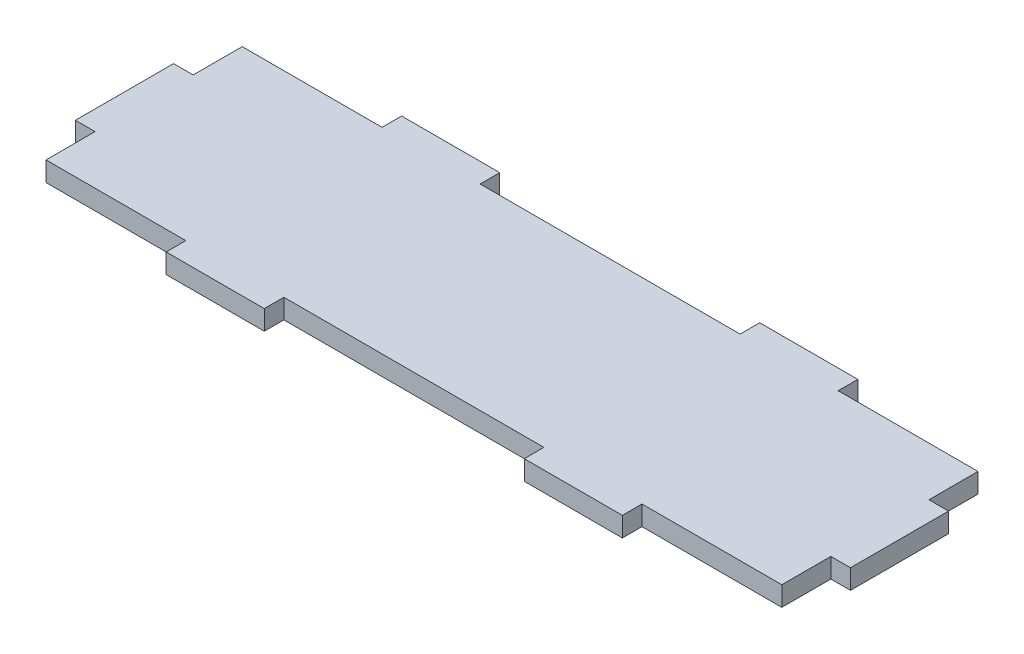
ISO-10303-21;
HEADER;
FILE_DESCRIPTION(('STEP AP214'),'2;1');
FILE_NAME('part.step','',(''),(''),'','','');
FILE_SCHEMA(('AUTOMOTIVE_DESIGN { 1 0 10303 214 1 1 1 1 }'));
ENDSEC;
DATA;
#1=APPLICATION_CONTEXT('core data for automotive mechanical design processes');
#2=APPLICATION_PROTOCOL_DEFINITION('international standard','automotive_design',2000,#1);
#3=PRODUCT_CONTEXT('',#1,'mechanical');
#4=PRODUCT('Part','Part','',(#3));
#5=PRODUCT_RELATED_PRODUCT_CATEGORY('part','',(#4));
#6=PRODUCT_DEFINITION_FORMATION('','',#4);
#7=PRODUCT_DEFINITION_CONTEXT('part definition',#1,'design');
#8=PRODUCT_DEFINITION('design','',#6,#7);
#9=PRODUCT_DEFINITION_SHAPE('','',#8);
#10=(LENGTH_UNIT() NAMED_UNIT(*) SI_UNIT(.MILLI.,.METRE.));
#11=(NAMED_UNIT(*) PLANE_ANGLE_UNIT() SI_UNIT($,.RADIAN.));
#12=(NAMED_UNIT(*) SI_UNIT($,.STERADIAN.) SOLID_ANGLE_UNIT());
#13=UNCERTAINTY_MEASURE_WITH_UNIT(LENGTH_MEASURE(1.E-05),#10,'distance_accuracy_value','');
#14=(GEOMETRIC_REPRESENTATION_CONTEXT(3) GLOBAL_UNCERTAINTY_ASSIGNED_CONTEXT((#13)) GLOBAL_UNIT_ASSIGNED_CONTEXT((#10,
#11,#12)) REPRESENTATION_CONTEXT('',''));
#15=CARTESIAN_POINT('',(0.,0.,0.));
#16=DIRECTION('',(0.,0.,1.));
#17=DIRECTION('',(1.,0.,0.));
#18=AXIS2_PLACEMENT_3D('',#15,#16,#17);
#19=CARTESIAN_POINT('',(0.,4.,0.));
#20=DIRECTION('',(1.,0.,0.));
#21=DIRECTION('',(0.,0.,-1.));
#22=AXIS2_PLACEMENT_3D('',#19,#20,#21);
#23=PLANE('',#22);
#24=DIRECTION('',(0.,0.,1.));
#25=VECTOR('',#24,1.);
#26=CARTESIAN_POINT('',(0.,0.,0.));
#27=LINE('',#26,#25);
#28=CARTESIAN_POINT('',(0.,0.,-9.99999999999999));
#29=VERTEX_POINT('',#28);
#30=CARTESIAN_POINT('',(0.,0.,0.));
#31=VERTEX_POINT('',#30);
#32=EDGE_CURVE('E250',#29,#31,#27,.T.);
#33=ORIENTED_EDGE('',*,*,#32,.T.);
#34=DIRECTION('',(0.,-1.,0.));
#35=VECTOR('',#34,1.);
#36=CARTESIAN_POINT('',(0.,4.,0.));
#37=LINE('',#36,#35);
#38=CARTESIAN_POINT('',(0.,4.,0.));
#39=VERTEX_POINT('',#38);
#40=EDGE_CURVE('E11',#39,#31,#37,.T.);
#41=ORIENTED_EDGE('',*,*,#40,.F.);
#42=DIRECTION('',(0.,0.,1.));
#43=VECTOR('',#42,1.);
#44=CARTESIAN_POINT('',(0.,4.,0.));
#45=LINE('',#44,#43);
#46=CARTESIAN_POINT('',(0.,4.,-9.99999999999999));
#47=VERTEX_POINT('',#46);
#48=EDGE_CURVE('E304',#47,#39,#45,.T.);
#49=ORIENTED_EDGE('',*,*,#48,.F.);
#50=DIRECTION('',(0.,-1.,0.));
#51=VECTOR('',#50,1.);
#52=CARTESIAN_POINT('',(0.,4.,-9.99999999999999));
#53=LINE('',#52,#51);
#54=EDGE_CURVE('E246',#47,#29,#53,.T.);
#55=ORIENTED_EDGE('',*,*,#54,.T.);
#56=EDGE_LOOP('',(#33,#41,#49,#55));
#57=FACE_BOUND('',#56,.T.);
#58=ADVANCED_FACE('F34',(#57),#23,.F.);
#59=CARTESIAN_POINT('',(0.,4.,0.));
#60=DIRECTION('',(0.,0.,-1.));
#61=DIRECTION('',(-1.,0.,0.));
#62=AXIS2_PLACEMENT_3D('',#59,#60,#61);
#63=PLANE('',#62);
#64=DIRECTION('',(1.,0.,0.));
#65=VECTOR('',#64,1.);
#66=CARTESIAN_POINT('',(0.,0.,0.));
#67=LINE('',#66,#65);
#68=CARTESIAN_POINT('',(28.5,0.,0.));
#69=VERTEX_POINT('',#68);
#70=EDGE_CURVE('E253',#31,#69,#67,.T.);
#71=ORIENTED_EDGE('',*,*,#70,.T.);
#72=DIRECTION('',(0.,-1.,0.));
#73=VECTOR('',#72,1.);
#74=CARTESIAN_POINT('',(28.5,4.,0.));
#75=LINE('',#74,#73);
#76=CARTESIAN_POINT('',(28.5,4.,0.));
#77=VERTEX_POINT('',#76);
#78=EDGE_CURVE('E42',#77,#69,#75,.T.);
#79=ORIENTED_EDGE('',*,*,#78,.F.);
#80=DIRECTION('',(1.,0.,0.));
#81=VECTOR('',#80,1.);
#82=CARTESIAN_POINT('',(0.,4.,0.));
#83=LINE('',#82,#81);
#84=EDGE_CURVE('E153',#39,#77,#83,.T.);
#85=ORIENTED_EDGE('',*,*,#84,.F.);
#86=ORIENTED_EDGE('',*,*,#40,.T.);
#87=EDGE_LOOP('',(#71,#79,#85,#86));
#88=FACE_BOUND('',#87,.T.);
#89=ADVANCED_FACE('F462',(#88),#63,.F.);
#90=CARTESIAN_POINT('',(28.5,4.,0.));
#91=DIRECTION('',(1.,0.,0.));
#92=DIRECTION('',(0.,0.,-1.));
#93=AXIS2_PLACEMENT_3D('',#90,#91,#92);
#94=PLANE('',#93);
#95=DIRECTION('',(0.,0.,1.));
#96=VECTOR('',#95,1.);
#97=CARTESIAN_POINT('',(28.5,0.,0.));
#98=LINE('',#97,#96);
#99=CARTESIAN_POINT('',(28.5,0.,4.));
#100=VERTEX_POINT('',#99);
#101=EDGE_CURVE('E255',#69,#100,#98,.T.);
#102=ORIENTED_EDGE('',*,*,#101,.T.);
#103=DIRECTION('',(0.,-1.,0.));
#104=VECTOR('',#103,1.);
#105=CARTESIAN_POINT('',(28.5,4.,4.));
#106=LINE('',#105,#104);
#107=CARTESIAN_POINT('',(28.5,4.,4.));
#108=VERTEX_POINT('',#107);
#109=EDGE_CURVE('E371',#108,#100,#106,.T.);
#110=ORIENTED_EDGE('',*,*,#109,.F.);
#111=DIRECTION('',(0.,0.,1.));
#112=VECTOR('',#111,1.);
#113=CARTESIAN_POINT('',(28.5,4.,0.));
#114=LINE('',#113,#112);
#115=EDGE_CURVE('E379',#77,#108,#114,.T.);
#116=ORIENTED_EDGE('',*,*,#115,.F.);
#117=ORIENTED_EDGE('',*,*,#78,.T.);
#118=EDGE_LOOP('',(#102,#110,#116,#117));
#119=FACE_BOUND('',#118,.T.);
#120=ADVANCED_FACE('F377',(#119),#94,.F.);
#121=CARTESIAN_POINT('',(28.5,4.,4.));
#122=DIRECTION('',(0.,0.,-1.));
#123=DIRECTION('',(-1.,0.,0.));
#124=AXIS2_PLACEMENT_3D('',#121,#122,#123);
#125=PLANE('',#124);
#126=DIRECTION('',(1.,0.,0.));
#127=VECTOR('',#126,1.);
#128=CARTESIAN_POINT('',(28.5,0.,4.));
#129=LINE('',#128,#127);
#130=CARTESIAN_POINT('',(48.5,0.,4.));
#131=VERTEX_POINT('',#130);
#132=EDGE_CURVE('E257',#100,#131,#129,.T.);
#133=ORIENTED_EDGE('',*,*,#132,.T.);
#134=DIRECTION('',(0.,-1.,0.));
#135=VECTOR('',#134,1.);
#136=CARTESIAN_POINT('',(48.5,4.,4.));
#137=LINE('',#136,#135);
#138=CARTESIAN_POINT('',(48.5,4.,4.));
#139=VERTEX_POINT('',#138);
#140=EDGE_CURVE('E368',#139,#131,#137,.T.);
#141=ORIENTED_EDGE('',*,*,#140,.F.);
#142=DIRECTION('',(1.,0.,0.));
#143=VECTOR('',#142,1.);
#144=CARTESIAN_POINT('',(28.5,4.,4.));
#145=LINE('',#144,#143);
#146=EDGE_CURVE('E397',#108,#139,#145,.T.);
#147=ORIENTED_EDGE('',*,*,#146,.F.);
#148=ORIENTED_EDGE('',*,*,#109,.T.);
#149=EDGE_LOOP('',(#133,#141,#147,#148));
#150=FACE_BOUND('',#149,.T.);
#151=ADVANCED_FACE('F388',(#150),#125,.F.);
#152=CARTESIAN_POINT('',(48.5,4.,0.));
#153=DIRECTION('',(-1.,0.,0.));
#154=DIRECTION('',(0.,0.,1.));
#155=AXIS2_PLACEMENT_3D('',#152,#153,#154);
#156=PLANE('',#155);
#157=DIRECTION('',(0.,0.,-1.));
#158=VECTOR('',#157,1.);
#159=CARTESIAN_POINT('',(48.5,0.,0.));
#160=LINE('',#159,#158);
#161=CARTESIAN_POINT('',(48.5,0.,0.));
#162=VERTEX_POINT('',#161);
#163=EDGE_CURVE('E259',#131,#162,#160,.T.);
#164=ORIENTED_EDGE('',*,*,#163,.T.);
#165=DIRECTION('',(0.,-1.,0.));
#166=VECTOR('',#165,1.);
#167=CARTESIAN_POINT('',(48.5,4.,0.));
#168=LINE('',#167,#166);
#169=CARTESIAN_POINT('',(48.5,4.,0.));
#170=VERTEX_POINT('',#169);
#171=EDGE_CURVE('E365',#170,#162,#168,.T.);
#172=ORIENTED_EDGE('',*,*,#171,.F.);
#173=DIRECTION('',(0.,0.,-1.));
#174=VECTOR('',#173,1.);
#175=CARTESIAN_POINT('',(48.5,4.,0.));
#176=LINE('',#175,#174);
#177=EDGE_CURVE('E394',#139,#170,#176,.T.);
#178=ORIENTED_EDGE('',*,*,#177,.F.);
#179=ORIENTED_EDGE('',*,*,#140,.T.);
#180=EDGE_LOOP('',(#164,#172,#178,#179));
#181=FACE_BOUND('',#180,.T.);
#182=ADVANCED_FACE('F392',(#181),#156,.F.);
#183=CARTESIAN_POINT('',(48.5,4.,0.));
#184=DIRECTION('',(0.,0.,-1.));
#185=DIRECTION('',(-1.,0.,0.));
#186=AXIS2_PLACEMENT_3D('',#183,#184,#185);
#187=PLANE('',#186);
#188=DIRECTION('',(1.,0.,0.));
#189=VECTOR('',#188,1.);
#190=CARTESIAN_POINT('',(48.5,0.,0.));
#191=LINE('',#190,#189);
#192=CARTESIAN_POINT('',(101.5,0.,0.));
#193=VERTEX_POINT('',#192);
#194=EDGE_CURVE('E261',#162,#193,#191,.T.);
#195=ORIENTED_EDGE('',*,*,#194,.T.);
#196=DIRECTION('',(0.,-1.,0.));
#197=VECTOR('',#196,1.);
#198=CARTESIAN_POINT('',(101.5,4.,0.));
#199=LINE('',#198,#197);
#200=CARTESIAN_POINT('',(101.5,4.,0.));
#201=VERTEX_POINT('',#200);
#202=EDGE_CURVE('E362',#201,#193,#199,.T.);
#203=ORIENTED_EDGE('',*,*,#202,.F.);
#204=DIRECTION('',(1.,0.,0.));
#205=VECTOR('',#204,1.);
#206=CARTESIAN_POINT('',(48.5,4.,0.));
#207=LINE('',#206,#205);
#208=EDGE_CURVE('E396',#170,#201,#207,.T.);
#209=ORIENTED_EDGE('',*,*,#208,.F.);
#210=ORIENTED_EDGE('',*,*,#171,.T.);
#211=EDGE_LOOP('',(#195,#203,#209,#210));
#212=FACE_BOUND('',#211,.T.);
#213=ADVANCED_FACE('F475',(#212),#187,.F.);
#214=CARTESIAN_POINT('',(101.5,4.,0.));
#215=DIRECTION('',(1.,0.,0.));
#216=DIRECTION('',(0.,0.,-1.));
#217=AXIS2_PLACEMENT_3D('',#214,#215,#216);
#218=PLANE('',#217);
#219=DIRECTION('',(0.,0.,1.));
#220=VECTOR('',#219,1.);
#221=CARTESIAN_POINT('',(101.5,0.,0.));
#222=LINE('',#221,#220);
#223=CARTESIAN_POINT('',(101.5,0.,4.));
#224=VERTEX_POINT('',#223);
#225=EDGE_CURVE('E263',#193,#224,#222,.T.);
#226=ORIENTED_EDGE('',*,*,#225,.T.);
#227=DIRECTION('',(0.,-1.,0.));
#228=VECTOR('',#227,1.);
#229=CARTESIAN_POINT('',(101.5,4.,4.));
#230=LINE('',#229,#228);
#231=CARTESIAN_POINT('',(101.5,4.,4.));
#232=VERTEX_POINT('',#231);
#233=EDGE_CURVE('E359',#232,#224,#230,.T.);
#234=ORIENTED_EDGE('',*,*,#233,.F.);
#235=DIRECTION('',(0.,0.,1.));
#236=VECTOR('',#235,1.);
#237=CARTESIAN_POINT('',(101.5,4.,0.));
#238=LINE('',#237,#236);
#239=EDGE_CURVE('E399',#201,#232,#238,.T.);
#240=ORIENTED_EDGE('',*,*,#239,.F.);
#241=ORIENTED_EDGE('',*,*,#202,.T.);
#242=EDGE_LOOP('',(#226,#234,#240,#241));
#243=FACE_BOUND('',#242,.T.);
#244=ADVANCED_FACE('F478',(#243),#218,.F.);
#245=CARTESIAN_POINT('',(121.5,4.,4.));
#246=DIRECTION('',(0.,0.,-1.));
#247=DIRECTION('',(-1.,0.,0.));
#248=AXIS2_PLACEMENT_3D('',#245,#246,#247);
#249=PLANE('',#248);
#250=DIRECTION('',(1.,0.,0.));
#251=VECTOR('',#250,1.);
#252=CARTESIAN_POINT('',(121.5,0.,4.));
#253=LINE('',#252,#251);
#254=CARTESIAN_POINT('',(121.5,0.,4.));
#255=VERTEX_POINT('',#254);
#256=EDGE_CURVE('E265',#224,#255,#253,.T.);
#257=ORIENTED_EDGE('',*,*,#256,.T.);
#258=DIRECTION('',(0.,-1.,0.));
#259=VECTOR('',#258,1.);
#260=CARTESIAN_POINT('',(121.5,4.,4.));
#261=LINE('',#260,#259);
#262=CARTESIAN_POINT('',(121.5,4.,4.));
#263=VERTEX_POINT('',#262);
#264=EDGE_CURVE('E356',#263,#255,#261,.T.);
#265=ORIENTED_EDGE('',*,*,#264,.F.);
#266=DIRECTION('',(1.,0.,0.));
#267=VECTOR('',#266,1.);
#268=CARTESIAN_POINT('',(121.5,4.,4.));
#269=LINE('',#268,#267);
#270=EDGE_CURVE('E405',#232,#263,#269,.T.);
#271=ORIENTED_EDGE('',*,*,#270,.F.);
#272=ORIENTED_EDGE('',*,*,#233,.T.);
#273=EDGE_LOOP('',(#257,#265,#271,#272));
#274=FACE_BOUND('',#273,.T.);
#275=ADVANCED_FACE('F482',(#274),#249,.F.);
#276=CARTESIAN_POINT('',(121.5,4.,0.));
#277=DIRECTION('',(-1.,0.,0.));
#278=DIRECTION('',(0.,0.,1.));
#279=AXIS2_PLACEMENT_3D('',#276,#277,#278);
#280=PLANE('',#279);
#281=DIRECTION('',(0.,0.,-1.));
#282=VECTOR('',#281,1.);
#283=CARTESIAN_POINT('',(121.5,0.,0.));
#284=LINE('',#283,#282);
#285=CARTESIAN_POINT('',(121.5,0.,0.));
#286=VERTEX_POINT('',#285);
#287=EDGE_CURVE('E267',#255,#286,#284,.T.);
#288=ORIENTED_EDGE('',*,*,#287,.T.);
#289=DIRECTION('',(0.,-1.,0.));
#290=VECTOR('',#289,1.);
#291=CARTESIAN_POINT('',(121.5,4.,0.));
#292=LINE('',#291,#290);
#293=CARTESIAN_POINT('',(121.5,4.,0.));
#294=VERTEX_POINT('',#293);
#295=EDGE_CURVE('E353',#294,#286,#292,.T.);
#296=ORIENTED_EDGE('',*,*,#295,.F.);
#297=DIRECTION('',(0.,0.,-1.));
#298=VECTOR('',#297,1.);
#299=CARTESIAN_POINT('',(121.5,4.,0.));
#300=LINE('',#299,#298);
#301=EDGE_CURVE('E407',#263,#294,#300,.T.);
#302=ORIENTED_EDGE('',*,*,#301,.F.);
#303=ORIENTED_EDGE('',*,*,#264,.T.);
#304=EDGE_LOOP('',(#288,#296,#302,#303));
#305=FACE_BOUND('',#304,.T.);
#306=ADVANCED_FACE('F486',(#305),#280,.F.);
#307=CARTESIAN_POINT('',(121.5,4.,0.));
#308=DIRECTION('',(0.,0.,-1.));
#309=DIRECTION('',(-1.,0.,0.));
#310=AXIS2_PLACEMENT_3D('',#307,#308,#309);
#311=PLANE('',#310);
#312=DIRECTION('',(1.,0.,0.));
#313=VECTOR('',#312,1.);
#314=CARTESIAN_POINT('',(121.5,0.,0.));
#315=LINE('',#314,#313);
#316=CARTESIAN_POINT('',(150.,0.,0.));
#317=VERTEX_POINT('',#316);
#318=EDGE_CURVE('E269',#286,#317,#315,.T.);
#319=ORIENTED_EDGE('',*,*,#318,.T.);
#320=DIRECTION('',(0.,-1.,0.));
#321=VECTOR('',#320,1.);
#322=CARTESIAN_POINT('',(150.,4.,0.));
#323=LINE('',#322,#321);
#324=CARTESIAN_POINT('',(150.,4.,0.));
#325=VERTEX_POINT('',#324);
#326=EDGE_CURVE('E350',#325,#317,#323,.T.);
#327=ORIENTED_EDGE('',*,*,#326,.F.);
#328=DIRECTION('',(1.,0.,0.));
#329=VECTOR('',#328,1.);
#330=CARTESIAN_POINT('',(121.5,4.,0.));
#331=LINE('',#330,#329);
#332=EDGE_CURVE('E409',#294,#325,#331,.T.);
#333=ORIENTED_EDGE('',*,*,#332,.F.);
#334=ORIENTED_EDGE('',*,*,#295,.T.);
#335=EDGE_LOOP('',(#319,#327,#333,#334));
#336=FACE_BOUND('',#335,.T.);
#337=ADVANCED_FACE('F490',(#336),#311,.F.);
#338=CARTESIAN_POINT('',(150.,4.,0.));
#339=DIRECTION('',(-1.,0.,0.));
#340=DIRECTION('',(0.,0.,1.));
#341=AXIS2_PLACEMENT_3D('',#338,#339,#340);
#342=PLANE('',#341);
#343=DIRECTION('',(0.,0.,-1.));
#344=VECTOR('',#343,1.);
#345=CARTESIAN_POINT('',(150.,0.,0.));
#346=LINE('',#345,#344);
#347=CARTESIAN_POINT('',(150.,0.,-9.99999999999999));
#348=VERTEX_POINT('',#347);
#349=EDGE_CURVE('E271',#317,#348,#346,.T.);
#350=ORIENTED_EDGE('',*,*,#349,.T.);
#351=DIRECTION('',(0.,-1.,0.));
#352=VECTOR('',#351,1.);
#353=CARTESIAN_POINT('',(150.,4.,-9.99999999999999));
#354=LINE('',#353,#352);
#355=CARTESIAN_POINT('',(150.,4.,-9.99999999999999));
#356=VERTEX_POINT('',#355);
#357=EDGE_CURVE('E347',#356,#348,#354,.T.);
#358=ORIENTED_EDGE('',*,*,#357,.F.);
#359=DIRECTION('',(0.,0.,-1.));
#360=VECTOR('',#359,1.);
#361=CARTESIAN_POINT('',(150.,4.,0.));
#362=LINE('',#361,#360);
#363=EDGE_CURVE('E411',#325,#356,#362,.T.);
#364=ORIENTED_EDGE('',*,*,#363,.F.);
#365=ORIENTED_EDGE('',*,*,#326,.T.);
#366=EDGE_LOOP('',(#350,#358,#364,#365));
#367=FACE_BOUND('',#366,.T.);
#368=ADVANCED_FACE('F494',(#367),#342,.F.);
#369=CARTESIAN_POINT('',(150.,4.,-9.99999999999999));
#370=DIRECTION('',(0.,0.,-1.));
#371=DIRECTION('',(-1.,0.,0.));
#372=AXIS2_PLACEMENT_3D('',#369,#370,#371);
#373=PLANE('',#372);
#374=DIRECTION('',(1.,0.,0.));
#375=VECTOR('',#374,1.);
#376=CARTESIAN_POINT('',(150.,0.,-9.99999999999999));
#377=LINE('',#376,#375);
#378=CARTESIAN_POINT('',(154.,0.,-9.99999999999999));
#379=VERTEX_POINT('',#378);
#380=EDGE_CURVE('E273',#348,#379,#377,.T.);
#381=ORIENTED_EDGE('',*,*,#380,.T.);
#382=DIRECTION('',(0.,-1.,0.));
#383=VECTOR('',#382,1.);
#384=CARTESIAN_POINT('',(154.,4.,-9.99999999999999));
#385=LINE('',#384,#383);
#386=CARTESIAN_POINT('',(154.,4.,-9.99999999999999));
#387=VERTEX_POINT('',#386);
#388=EDGE_CURVE('E344',#387,#379,#385,.T.);
#389=ORIENTED_EDGE('',*,*,#388,.F.);
#390=DIRECTION('',(1.,0.,0.));
#391=VECTOR('',#390,1.);
#392=CARTESIAN_POINT('',(150.,4.,-9.99999999999999));
#393=LINE('',#392,#391);
#394=EDGE_CURVE('E413',#356,#387,#393,.T.);
#395=ORIENTED_EDGE('',*,*,#394,.F.);
#396=ORIENTED_EDGE('',*,*,#357,.T.);
#397=EDGE_LOOP('',(#381,#389,#395,#396));
#398=FACE_BOUND('',#397,.T.);
#399=ADVANCED_FACE('F498',(#398),#373,.F.);
#400=CARTESIAN_POINT('',(154.,4.,-9.99999999999999));
#401=DIRECTION('',(-1.,0.,0.));
#402=DIRECTION('',(0.,0.,1.));
#403=AXIS2_PLACEMENT_3D('',#400,#401,#402);
#404=PLANE('',#403);
#405=DIRECTION('',(0.,0.,-1.));
#406=VECTOR('',#405,1.);
#407=CARTESIAN_POINT('',(154.,0.,-9.99999999999999));
#408=LINE('',#407,#406);
#409=CARTESIAN_POINT('',(154.,0.,-30.));
#410=VERTEX_POINT('',#409);
#411=EDGE_CURVE('E275',#379,#410,#408,.T.);
#412=ORIENTED_EDGE('',*,*,#411,.T.);
#413=DIRECTION('',(0.,-1.,0.));
#414=VECTOR('',#413,1.);
#415=CARTESIAN_POINT('',(154.,4.,-30.));
#416=LINE('',#415,#414);
#417=CARTESIAN_POINT('',(154.,4.,-30.));
#418=VERTEX_POINT('',#417);
#419=EDGE_CURVE('E341',#418,#410,#416,.T.);
#420=ORIENTED_EDGE('',*,*,#419,.F.);
#421=DIRECTION('',(0.,0.,-1.));
#422=VECTOR('',#421,1.);
#423=CARTESIAN_POINT('',(154.,4.,-9.99999999999999));
#424=LINE('',#423,#422);
#425=EDGE_CURVE('E415',#387,#418,#424,.T.);
#426=ORIENTED_EDGE('',*,*,#425,.F.);
#427=ORIENTED_EDGE('',*,*,#388,.T.);
#428=EDGE_LOOP('',(#412,#420,#426,#427));
#429=FACE_BOUND('',#428,.T.);
#430=ADVANCED_FACE('F502',(#429),#404,.F.);
#431=CARTESIAN_POINT('',(150.,4.,-30.));
#432=DIRECTION('',(0.,0.,1.));
#433=DIRECTION('',(1.,0.,0.));
#434=AXIS2_PLACEMENT_3D('',#431,#432,#433);
#435=PLANE('',#434);
#436=DIRECTION('',(-1.,0.,0.));
#437=VECTOR('',#436,1.);
#438=CARTESIAN_POINT('',(150.,0.,-30.));
#439=LINE('',#438,#437);
#440=CARTESIAN_POINT('',(150.,0.,-30.));
#441=VERTEX_POINT('',#440);
#442=EDGE_CURVE('E277',#410,#441,#439,.T.);
#443=ORIENTED_EDGE('',*,*,#442,.T.);
#444=DIRECTION('',(0.,-1.,0.));
#445=VECTOR('',#444,1.);
#446=CARTESIAN_POINT('',(150.,4.,-30.));
#447=LINE('',#446,#445);
#448=CARTESIAN_POINT('',(150.,4.,-30.));
#449=VERTEX_POINT('',#448);
#450=EDGE_CURVE('E338',#449,#441,#447,.T.);
#451=ORIENTED_EDGE('',*,*,#450,.F.);
#452=DIRECTION('',(-1.,0.,0.));
#453=VECTOR('',#452,1.);
#454=CARTESIAN_POINT('',(150.,4.,-30.));
#455=LINE('',#454,#453);
#456=EDGE_CURVE('E417',#418,#449,#455,.T.);
#457=ORIENTED_EDGE('',*,*,#456,.F.);
#458=ORIENTED_EDGE('',*,*,#419,.T.);
#459=EDGE_LOOP('',(#443,#451,#457,#458));
#460=FACE_BOUND('',#459,.T.);
#461=ADVANCED_FACE('F506',(#460),#435,.F.);
#462=CARTESIAN_POINT('',(150.,4.,-30.));
#463=DIRECTION('',(-1.,0.,0.));
#464=DIRECTION('',(0.,0.,1.));
#465=AXIS2_PLACEMENT_3D('',#462,#463,#464);
#466=PLANE('',#465);
#467=DIRECTION('',(0.,0.,-1.));
#468=VECTOR('',#467,1.);
#469=CARTESIAN_POINT('',(150.,0.,-30.));
#470=LINE('',#469,#468);
#471=CARTESIAN_POINT('',(150.,0.,-40.));
#472=VERTEX_POINT('',#471);
#473=EDGE_CURVE('E279',#441,#472,#470,.T.);
#474=ORIENTED_EDGE('',*,*,#473,.T.);
#475=DIRECTION('',(0.,-1.,0.));
#476=VECTOR('',#475,1.);
#477=CARTESIAN_POINT('',(150.,4.,-40.));
#478=LINE('',#477,#476);
#479=CARTESIAN_POINT('',(150.,4.,-40.));
#480=VERTEX_POINT('',#479);
#481=EDGE_CURVE('E335',#480,#472,#478,.T.);
#482=ORIENTED_EDGE('',*,*,#481,.F.);
#483=DIRECTION('',(0.,0.,-1.));
#484=VECTOR('',#483,1.);
#485=CARTESIAN_POINT('',(150.,4.,-30.));
#486=LINE('',#485,#484);
#487=EDGE_CURVE('E419',#449,#480,#486,.T.);
#488=ORIENTED_EDGE('',*,*,#487,.F.);
#489=ORIENTED_EDGE('',*,*,#450,.T.);
#490=EDGE_LOOP('',(#474,#482,#488,#489));
#491=FACE_BOUND('',#490,.T.);
#492=ADVANCED_FACE('F510',(#491),#466,.F.);
#493=CARTESIAN_POINT('',(121.5,4.,-40.));
#494=DIRECTION('',(0.,0.,1.));
#495=DIRECTION('',(1.,0.,0.));
#496=AXIS2_PLACEMENT_3D('',#493,#494,#495);
#497=PLANE('',#496);
#498=DIRECTION('',(-1.,0.,0.));
#499=VECTOR('',#498,1.);
#500=CARTESIAN_POINT('',(121.5,0.,-40.));
#501=LINE('',#500,#499);
#502=CARTESIAN_POINT('',(121.5,0.,-40.));
#503=VERTEX_POINT('',#502);
#504=EDGE_CURVE('E281',#472,#503,#501,.T.);
#505=ORIENTED_EDGE('',*,*,#504,.T.);
#506=DIRECTION('',(0.,-1.,0.));
#507=VECTOR('',#506,1.);
#508=CARTESIAN_POINT('',(121.5,4.,-40.));
#509=LINE('',#508,#507);
#510=CARTESIAN_POINT('',(121.5,4.,-40.));
#511=VERTEX_POINT('',#510);
#512=EDGE_CURVE('E332',#511,#503,#509,.T.);
#513=ORIENTED_EDGE('',*,*,#512,.F.);
#514=DIRECTION('',(-1.,0.,0.));
#515=VECTOR('',#514,1.);
#516=CARTESIAN_POINT('',(121.5,4.,-40.));
#517=LINE('',#516,#515);
#518=EDGE_CURVE('E421',#480,#511,#517,.T.);
#519=ORIENTED_EDGE('',*,*,#518,.F.);
#520=ORIENTED_EDGE('',*,*,#481,.T.);
#521=EDGE_LOOP('',(#505,#513,#519,#520));
#522=FACE_BOUND('',#521,.T.);
#523=ADVANCED_FACE('F514',(#522),#497,.F.);
#524=CARTESIAN_POINT('',(121.5,4.,-40.));
#525=DIRECTION('',(-1.,0.,0.));
#526=DIRECTION('',(0.,0.,1.));
#527=AXIS2_PLACEMENT_3D('',#524,#525,#526);
#528=PLANE('',#527);
#529=DIRECTION('',(0.,0.,-1.));
#530=VECTOR('',#529,1.);
#531=CARTESIAN_POINT('',(121.5,0.,-40.));
#532=LINE('',#531,#530);
#533=CARTESIAN_POINT('',(121.5,0.,-44.));
#534=VERTEX_POINT('',#533);
#535=EDGE_CURVE('E283',#503,#534,#532,.T.);
#536=ORIENTED_EDGE('',*,*,#535,.T.);
#537=DIRECTION('',(0.,-1.,0.));
#538=VECTOR('',#537,1.);
#539=CARTESIAN_POINT('',(121.5,4.,-44.));
#540=LINE('',#539,#538);
#541=CARTESIAN_POINT('',(121.5,4.,-44.));
#542=VERTEX_POINT('',#541);
#543=EDGE_CURVE('E329',#542,#534,#540,.T.);
#544=ORIENTED_EDGE('',*,*,#543,.F.);
#545=DIRECTION('',(0.,0.,-1.));
#546=VECTOR('',#545,1.);
#547=CARTESIAN_POINT('',(121.5,4.,-40.));
#548=LINE('',#547,#546);
#549=EDGE_CURVE('E423',#511,#542,#548,.T.);
#550=ORIENTED_EDGE('',*,*,#549,.F.);
#551=ORIENTED_EDGE('',*,*,#512,.T.);
#552=EDGE_LOOP('',(#536,#544,#550,#551));
#553=FACE_BOUND('',#552,.T.);
#554=ADVANCED_FACE('F518',(#553),#528,.F.);
#555=CARTESIAN_POINT('',(121.5,4.,-44.));
#556=DIRECTION('',(0.,0.,1.));
#557=DIRECTION('',(1.,0.,0.));
#558=AXIS2_PLACEMENT_3D('',#555,#556,#557);
#559=PLANE('',#558);
#560=DIRECTION('',(-1.,0.,0.));
#561=VECTOR('',#560,1.);
#562=CARTESIAN_POINT('',(121.5,0.,-44.));
#563=LINE('',#562,#561);
#564=CARTESIAN_POINT('',(101.5,0.,-44.));
#565=VERTEX_POINT('',#564);
#566=EDGE_CURVE('E285',#534,#565,#563,.T.);
#567=ORIENTED_EDGE('',*,*,#566,.T.);
#568=DIRECTION('',(0.,-1.,0.));
#569=VECTOR('',#568,1.);
#570=CARTESIAN_POINT('',(101.5,4.,-44.));
#571=LINE('',#570,#569);
#572=CARTESIAN_POINT('',(101.5,4.,-44.));
#573=VERTEX_POINT('',#572);
#574=EDGE_CURVE('E326',#573,#565,#571,.T.);
#575=ORIENTED_EDGE('',*,*,#574,.F.);
#576=DIRECTION('',(-1.,0.,0.));
#577=VECTOR('',#576,1.);
#578=CARTESIAN_POINT('',(121.5,4.,-44.));
#579=LINE('',#578,#577);
#580=EDGE_CURVE('E425',#542,#573,#579,.T.);
#581=ORIENTED_EDGE('',*,*,#580,.F.);
#582=ORIENTED_EDGE('',*,*,#543,.T.);
#583=EDGE_LOOP('',(#567,#575,#581,#582));
#584=FACE_BOUND('',#583,.T.);
#585=ADVANCED_FACE('F522',(#584),#559,.F.);
#586=CARTESIAN_POINT('',(101.5,4.,-40.));
#587=DIRECTION('',(1.,0.,0.));
#588=DIRECTION('',(0.,0.,-1.));
#589=AXIS2_PLACEMENT_3D('',#586,#587,#588);
#590=PLANE('',#589);
#591=DIRECTION('',(0.,0.,1.));
#592=VECTOR('',#591,1.);
#593=CARTESIAN_POINT('',(101.5,0.,-40.));
#594=LINE('',#593,#592);
#595=CARTESIAN_POINT('',(101.5,0.,-40.));
#596=VERTEX_POINT('',#595);
#597=EDGE_CURVE('E287',#565,#596,#594,.T.);
#598=ORIENTED_EDGE('',*,*,#597,.T.);
#599=DIRECTION('',(0.,-1.,0.));
#600=VECTOR('',#599,1.);
#601=CARTESIAN_POINT('',(101.5,4.,-40.));
#602=LINE('',#601,#600);
#603=CARTESIAN_POINT('',(101.5,4.,-40.));
#604=VERTEX_POINT('',#603);
#605=EDGE_CURVE('E323',#604,#596,#602,.T.);
#606=ORIENTED_EDGE('',*,*,#605,.F.);
#607=DIRECTION('',(0.,0.,1.));
#608=VECTOR('',#607,1.);
#609=CARTESIAN_POINT('',(101.5,4.,-40.));
#610=LINE('',#609,#608);
#611=EDGE_CURVE('E427',#573,#604,#610,.T.);
#612=ORIENTED_EDGE('',*,*,#611,.F.);
#613=ORIENTED_EDGE('',*,*,#574,.T.);
#614=EDGE_LOOP('',(#598,#606,#612,#613));
#615=FACE_BOUND('',#614,.T.);
#616=ADVANCED_FACE('F526',(#615),#590,.F.);
#617=CARTESIAN_POINT('',(48.5,4.,-40.));
#618=DIRECTION('',(0.,0.,1.));
#619=DIRECTION('',(1.,0.,0.));
#620=AXIS2_PLACEMENT_3D('',#617,#618,#619);
#621=PLANE('',#620);
#622=DIRECTION('',(-1.,0.,0.));
#623=VECTOR('',#622,1.);
#624=CARTESIAN_POINT('',(48.5,0.,-40.));
#625=LINE('',#624,#623);
#626=CARTESIAN_POINT('',(48.5,0.,-40.));
#627=VERTEX_POINT('',#626);
#628=EDGE_CURVE('E289',#596,#627,#625,.T.);
#629=ORIENTED_EDGE('',*,*,#628,.T.);
#630=DIRECTION('',(0.,-1.,0.));
#631=VECTOR('',#630,1.);
#632=CARTESIAN_POINT('',(48.5,4.,-40.));
#633=LINE('',#632,#631);
#634=CARTESIAN_POINT('',(48.5,4.,-40.));
#635=VERTEX_POINT('',#634);
#636=EDGE_CURVE('E320',#635,#627,#633,.T.);
#637=ORIENTED_EDGE('',*,*,#636,.F.);
#638=DIRECTION('',(-1.,0.,0.));
#639=VECTOR('',#638,1.);
#640=CARTESIAN_POINT('',(48.5,4.,-40.));
#641=LINE('',#640,#639);
#642=EDGE_CURVE('E429',#604,#635,#641,.T.);
#643=ORIENTED_EDGE('',*,*,#642,.F.);
#644=ORIENTED_EDGE('',*,*,#605,.T.);
#645=EDGE_LOOP('',(#629,#637,#643,#644));
#646=FACE_BOUND('',#645,.T.);
#647=ADVANCED_FACE('F530',(#646),#621,.F.);
#648=CARTESIAN_POINT('',(48.5,4.,-40.));
#649=DIRECTION('',(-1.,0.,0.));
#650=DIRECTION('',(0.,0.,1.));
#651=AXIS2_PLACEMENT_3D('',#648,#649,#650);
#652=PLANE('',#651);
#653=DIRECTION('',(0.,0.,-1.));
#654=VECTOR('',#653,1.);
#655=CARTESIAN_POINT('',(48.5,0.,-40.));
#656=LINE('',#655,#654);
#657=CARTESIAN_POINT('',(48.5,0.,-44.));
#658=VERTEX_POINT('',#657);
#659=EDGE_CURVE('E291',#627,#658,#656,.T.);
#660=ORIENTED_EDGE('',*,*,#659,.T.);
#661=DIRECTION('',(0.,-1.,0.));
#662=VECTOR('',#661,1.);
#663=CARTESIAN_POINT('',(48.5,4.,-44.));
#664=LINE('',#663,#662);
#665=CARTESIAN_POINT('',(48.5,4.,-44.));
#666=VERTEX_POINT('',#665);
#667=EDGE_CURVE('E317',#666,#658,#664,.T.);
#668=ORIENTED_EDGE('',*,*,#667,.F.);
#669=DIRECTION('',(0.,0.,-1.));
#670=VECTOR('',#669,1.);
#671=CARTESIAN_POINT('',(48.5,4.,-40.));
#672=LINE('',#671,#670);
#673=EDGE_CURVE('E431',#635,#666,#672,.T.);
#674=ORIENTED_EDGE('',*,*,#673,.F.);
#675=ORIENTED_EDGE('',*,*,#636,.T.);
#676=EDGE_LOOP('',(#660,#668,#674,#675));
#677=FACE_BOUND('',#676,.T.);
#678=ADVANCED_FACE('F534',(#677),#652,.F.);
#679=CARTESIAN_POINT('',(28.5,4.,-44.));
#680=DIRECTION('',(0.,0.,1.));
#681=DIRECTION('',(1.,0.,0.));
#682=AXIS2_PLACEMENT_3D('',#679,#680,#681);
#683=PLANE('',#682);
#684=DIRECTION('',(-1.,0.,0.));
#685=VECTOR('',#684,1.);
#686=CARTESIAN_POINT('',(28.5,0.,-44.));
#687=LINE('',#686,#685);
#688=CARTESIAN_POINT('',(28.5,0.,-44.));
#689=VERTEX_POINT('',#688);
#690=EDGE_CURVE('E293',#658,#689,#687,.T.);
#691=ORIENTED_EDGE('',*,*,#690,.T.);
#692=DIRECTION('',(0.,-1.,0.));
#693=VECTOR('',#692,1.);
#694=CARTESIAN_POINT('',(28.5,4.,-44.));
#695=LINE('',#694,#693);
#696=CARTESIAN_POINT('',(28.5,4.,-44.));
#697=VERTEX_POINT('',#696);
#698=EDGE_CURVE('E314',#697,#689,#695,.T.);
#699=ORIENTED_EDGE('',*,*,#698,.F.);
#700=DIRECTION('',(-1.,0.,0.));
#701=VECTOR('',#700,1.);
#702=CARTESIAN_POINT('',(28.5,4.,-44.));
#703=LINE('',#702,#701);
#704=EDGE_CURVE('E433',#666,#697,#703,.T.);
#705=ORIENTED_EDGE('',*,*,#704,.F.);
#706=ORIENTED_EDGE('',*,*,#667,.T.);
#707=EDGE_LOOP('',(#691,#699,#705,#706));
#708=FACE_BOUND('',#707,.T.);
#709=ADVANCED_FACE('F538',(#708),#683,.F.);
#710=CARTESIAN_POINT('',(28.5,4.,-40.));
#711=DIRECTION('',(1.,0.,0.));
#712=DIRECTION('',(0.,0.,-1.));
#713=AXIS2_PLACEMENT_3D('',#710,#711,#712);
#714=PLANE('',#713);
#715=DIRECTION('',(0.,0.,1.));
#716=VECTOR('',#715,1.);
#717=CARTESIAN_POINT('',(28.5,0.,-40.));
#718=LINE('',#717,#716);
#719=CARTESIAN_POINT('',(28.5,0.,-40.));
#720=VERTEX_POINT('',#719);
#721=EDGE_CURVE('E295',#689,#720,#718,.T.);
#722=ORIENTED_EDGE('',*,*,#721,.T.);
#723=DIRECTION('',(0.,-1.,0.));
#724=VECTOR('',#723,1.);
#725=CARTESIAN_POINT('',(28.5,4.,-40.));
#726=LINE('',#725,#724);
#727=CARTESIAN_POINT('',(28.5,4.,-40.));
#728=VERTEX_POINT('',#727);
#729=EDGE_CURVE('E311',#728,#720,#726,.T.);
#730=ORIENTED_EDGE('',*,*,#729,.F.);
#731=DIRECTION('',(0.,0.,1.));
#732=VECTOR('',#731,1.);
#733=CARTESIAN_POINT('',(28.5,4.,-40.));
#734=LINE('',#733,#732);
#735=EDGE_CURVE('E435',#697,#728,#734,.T.);
#736=ORIENTED_EDGE('',*,*,#735,.F.);
#737=ORIENTED_EDGE('',*,*,#698,.T.);
#738=EDGE_LOOP('',(#722,#730,#736,#737));
#739=FACE_BOUND('',#738,.T.);
#740=ADVANCED_FACE('F542',(#739),#714,.F.);
#741=CARTESIAN_POINT('',(0.,4.,-40.));
#742=DIRECTION('',(0.,0.,1.));
#743=DIRECTION('',(1.,0.,0.));
#744=AXIS2_PLACEMENT_3D('',#741,#742,#743);
#745=PLANE('',#744);
#746=DIRECTION('',(-1.,0.,0.));
#747=VECTOR('',#746,1.);
#748=CARTESIAN_POINT('',(0.,0.,-40.));
#749=LINE('',#748,#747);
#750=CARTESIAN_POINT('',(0.,0.,-40.));
#751=VERTEX_POINT('',#750);
#752=EDGE_CURVE('E297',#720,#751,#749,.T.);
#753=ORIENTED_EDGE('',*,*,#752,.T.);
#754=DIRECTION('',(0.,-1.,0.));
#755=VECTOR('',#754,1.);
#756=CARTESIAN_POINT('',(0.,4.,-40.));
#757=LINE('',#756,#755);
#758=CARTESIAN_POINT('',(0.,4.,-40.));
#759=VERTEX_POINT('',#758);
#760=EDGE_CURVE('E308',#759,#751,#757,.T.);
#761=ORIENTED_EDGE('',*,*,#760,.F.);
#762=DIRECTION('',(-1.,0.,0.));
#763=VECTOR('',#762,1.);
#764=CARTESIAN_POINT('',(0.,4.,-40.));
#765=LINE('',#764,#763);
#766=EDGE_CURVE('E437',#728,#759,#765,.T.);
#767=ORIENTED_EDGE('',*,*,#766,.F.);
#768=ORIENTED_EDGE('',*,*,#729,.T.);
#769=EDGE_LOOP('',(#753,#761,#767,#768));
#770=FACE_BOUND('',#769,.T.);
#771=ADVANCED_FACE('F443',(#770),#745,.F.);
#772=CARTESIAN_POINT('',(0.,4.,-30.));
#773=DIRECTION('',(1.,0.,0.));
#774=DIRECTION('',(0.,0.,-1.));
#775=AXIS2_PLACEMENT_3D('',#772,#773,#774);
#776=PLANE('',#775);
#777=DIRECTION('',(0.,0.,1.));
#778=VECTOR('',#777,1.);
#779=CARTESIAN_POINT('',(0.,0.,-30.));
#780=LINE('',#779,#778);
#781=CARTESIAN_POINT('',(0.,0.,-30.));
#782=VERTEX_POINT('',#781);
#783=EDGE_CURVE('E299',#751,#782,#780,.T.);
#784=ORIENTED_EDGE('',*,*,#783,.T.);
#785=DIRECTION('',(0.,-1.,0.));
#786=VECTOR('',#785,1.);
#787=CARTESIAN_POINT('',(0.,4.,-30.));
#788=LINE('',#787,#786);
#789=CARTESIAN_POINT('',(0.,4.,-30.));
#790=VERTEX_POINT('',#789);
#791=EDGE_CURVE('E241',#790,#782,#788,.T.);
#792=ORIENTED_EDGE('',*,*,#791,.F.);
#793=DIRECTION('',(0.,0.,1.));
#794=VECTOR('',#793,1.);
#795=CARTESIAN_POINT('',(0.,4.,-30.));
#796=LINE('',#795,#794);
#797=EDGE_CURVE('E232',#759,#790,#796,.T.);
#798=ORIENTED_EDGE('',*,*,#797,.F.);
#799=ORIENTED_EDGE('',*,*,#760,.T.);
#800=EDGE_LOOP('',(#784,#792,#798,#799));
#801=FACE_BOUND('',#800,.T.);
#802=ADVANCED_FACE('F447',(#801),#776,.F.);
#803=CARTESIAN_POINT('',(0.,4.,-30.));
#804=DIRECTION('',(0.,0.,1.));
#805=DIRECTION('',(1.,0.,0.));
#806=AXIS2_PLACEMENT_3D('',#803,#804,#805);
#807=PLANE('',#806);
#808=DIRECTION('',(-1.,0.,0.));
#809=VECTOR('',#808,1.);
#810=CARTESIAN_POINT('',(0.,0.,-30.));
#811=LINE('',#810,#809);
#812=CARTESIAN_POINT('',(-4.,0.,-30.));
#813=VERTEX_POINT('',#812);
#814=EDGE_CURVE('E240',#782,#813,#811,.T.);
#815=ORIENTED_EDGE('',*,*,#814,.T.);
#816=DIRECTION('',(0.,-1.,0.));
#817=VECTOR('',#816,1.);
#818=CARTESIAN_POINT('',(-4.,4.,-30.));
#819=LINE('',#818,#817);
#820=CARTESIAN_POINT('',(-4.,4.,-30.));
#821=VERTEX_POINT('',#820);
#822=EDGE_CURVE('E237',#821,#813,#819,.T.);
#823=ORIENTED_EDGE('',*,*,#822,.F.);
#824=DIRECTION('',(-1.,0.,0.));
#825=VECTOR('',#824,1.);
#826=CARTESIAN_POINT('',(0.,4.,-30.));
#827=LINE('',#826,#825);
#828=EDGE_CURVE('E226',#790,#821,#827,.T.);
#829=ORIENTED_EDGE('',*,*,#828,.F.);
#830=ORIENTED_EDGE('',*,*,#791,.T.);
#831=EDGE_LOOP('',(#815,#823,#829,#830));
#832=FACE_BOUND('',#831,.T.);
#833=ADVANCED_FACE('F238',(#832),#807,.F.);
#834=CARTESIAN_POINT('',(-4.,4.,-10.));
#835=DIRECTION('',(1.,0.,0.));
#836=DIRECTION('',(0.,0.,-1.));
#837=AXIS2_PLACEMENT_3D('',#834,#835,#836);
#838=PLANE('',#837);
#839=DIRECTION('',(0.,0.,1.));
#840=VECTOR('',#839,1.);
#841=CARTESIAN_POINT('',(-4.,0.,-10.));
#842=LINE('',#841,#840);
#843=CARTESIAN_POINT('',(-4.,0.,-10.));
#844=VERTEX_POINT('',#843);
#845=EDGE_CURVE('E139',#813,#844,#842,.T.);
#846=ORIENTED_EDGE('',*,*,#845,.T.);
#847=DIRECTION('',(0.,-1.,0.));
#848=VECTOR('',#847,1.);
#849=CARTESIAN_POINT('',(-4.,4.,-10.));
#850=LINE('',#849,#848);
#851=CARTESIAN_POINT('',(-4.,4.,-10.));
#852=VERTEX_POINT('',#851);
#853=EDGE_CURVE('E242',#852,#844,#850,.T.);
#854=ORIENTED_EDGE('',*,*,#853,.F.);
#855=DIRECTION('',(0.,0.,1.));
#856=VECTOR('',#855,1.);
#857=CARTESIAN_POINT('',(-4.,4.,-10.));
#858=LINE('',#857,#856);
#859=EDGE_CURVE('E230',#821,#852,#858,.T.);
#860=ORIENTED_EDGE('',*,*,#859,.F.);
#861=ORIENTED_EDGE('',*,*,#822,.T.);
#862=EDGE_LOOP('',(#846,#854,#860,#861));
#863=FACE_BOUND('',#862,.T.);
#864=ADVANCED_FACE('F244',(#863),#838,.F.);
#865=CARTESIAN_POINT('',(0.,4.,-9.99999999999999));
#866=DIRECTION('',(0.,0.,-1.));
#867=DIRECTION('',(-1.,0.,0.));
#868=AXIS2_PLACEMENT_3D('',#865,#866,#867);
#869=PLANE('',#868);
#870=DIRECTION('',(1.,0.,0.));
#871=VECTOR('',#870,1.);
#872=CARTESIAN_POINT('',(0.,0.,-9.99999999999999));
#873=LINE('',#872,#871);
#874=EDGE_CURVE('E145',#844,#29,#873,.T.);
#875=ORIENTED_EDGE('',*,*,#874,.T.);
#876=ORIENTED_EDGE('',*,*,#54,.F.);
#877=DIRECTION('',(1.,0.,0.));
#878=VECTOR('',#877,1.);
#879=CARTESIAN_POINT('',(0.,4.,-9.99999999999999));
#880=LINE('',#879,#878);
#881=EDGE_CURVE('E50',#852,#47,#880,.T.);
#882=ORIENTED_EDGE('',*,*,#881,.F.);
#883=ORIENTED_EDGE('',*,*,#853,.T.);
#884=EDGE_LOOP('',(#875,#876,#882,#883));
#885=FACE_BOUND('',#884,.T.);
#886=ADVANCED_FACE('F451',(#885),#869,.F.);
#887=CARTESIAN_POINT('',(0.,4.,0.));
#888=DIRECTION('',(0.,1.,0.));
#889=DIRECTION('',(0.,0.,1.));
#890=AXIS2_PLACEMENT_3D('',#887,#888,#889);
#891=PLANE('',#890);
#892=ORIENTED_EDGE('',*,*,#48,.T.);
#893=ORIENTED_EDGE('',*,*,#84,.T.);
#894=ORIENTED_EDGE('',*,*,#115,.T.);
#895=ORIENTED_EDGE('',*,*,#146,.T.);
#896=ORIENTED_EDGE('',*,*,#177,.T.);
#897=ORIENTED_EDGE('',*,*,#208,.T.);
#898=ORIENTED_EDGE('',*,*,#239,.T.);
#899=ORIENTED_EDGE('',*,*,#270,.T.);
#900=ORIENTED_EDGE('',*,*,#301,.T.);
#901=ORIENTED_EDGE('',*,*,#332,.T.);
#902=ORIENTED_EDGE('',*,*,#363,.T.);
#903=ORIENTED_EDGE('',*,*,#394,.T.);
#904=ORIENTED_EDGE('',*,*,#425,.T.);
#905=ORIENTED_EDGE('',*,*,#456,.T.);
#906=ORIENTED_EDGE('',*,*,#487,.T.);
#907=ORIENTED_EDGE('',*,*,#518,.T.);
#908=ORIENTED_EDGE('',*,*,#549,.T.);
#909=ORIENTED_EDGE('',*,*,#580,.T.);
#910=ORIENTED_EDGE('',*,*,#611,.T.);
#911=ORIENTED_EDGE('',*,*,#642,.T.);
#912=ORIENTED_EDGE('',*,*,#673,.T.);
#913=ORIENTED_EDGE('',*,*,#704,.T.);
#914=ORIENTED_EDGE('',*,*,#735,.T.);
#915=ORIENTED_EDGE('',*,*,#766,.T.);
#916=ORIENTED_EDGE('',*,*,#797,.T.);
#917=ORIENTED_EDGE('',*,*,#828,.T.);
#918=ORIENTED_EDGE('',*,*,#859,.T.);
#919=ORIENTED_EDGE('',*,*,#881,.T.);
#920=EDGE_LOOP('',(#892,#893,#894,#895,#896,#897,#898,#899,#900,#901,#902,#903,#904,#905,#906,
#907,#908,#909,#910,#911,#912,#913,#914,#915,#916,#917,#918,#919));
#921=FACE_BOUND('',#920,.T.);
#922=ADVANCED_FACE('F228',(#921),#891,.T.);
#923=CARTESIAN_POINT('',(0.,0.,0.));
#924=DIRECTION('',(0.,1.,0.));
#925=DIRECTION('',(0.,0.,1.));
#926=AXIS2_PLACEMENT_3D('',#923,#924,#925);
#927=PLANE('',#926);
#928=ORIENTED_EDGE('',*,*,#32,.F.);
#929=ORIENTED_EDGE('',*,*,#874,.F.);
#930=ORIENTED_EDGE('',*,*,#845,.F.);
#931=ORIENTED_EDGE('',*,*,#814,.F.);
#932=ORIENTED_EDGE('',*,*,#783,.F.);
#933=ORIENTED_EDGE('',*,*,#752,.F.);
#934=ORIENTED_EDGE('',*,*,#721,.F.);
#935=ORIENTED_EDGE('',*,*,#690,.F.);
#936=ORIENTED_EDGE('',*,*,#659,.F.);
#937=ORIENTED_EDGE('',*,*,#628,.F.);
#938=ORIENTED_EDGE('',*,*,#597,.F.);
#939=ORIENTED_EDGE('',*,*,#566,.F.);
#940=ORIENTED_EDGE('',*,*,#535,.F.);
#941=ORIENTED_EDGE('',*,*,#504,.F.);
#942=ORIENTED_EDGE('',*,*,#473,.F.);
#943=ORIENTED_EDGE('',*,*,#442,.F.);
#944=ORIENTED_EDGE('',*,*,#411,.F.);
#945=ORIENTED_EDGE('',*,*,#380,.F.);
#946=ORIENTED_EDGE('',*,*,#349,.F.);
#947=ORIENTED_EDGE('',*,*,#318,.F.);
#948=ORIENTED_EDGE('',*,*,#287,.F.);
#949=ORIENTED_EDGE('',*,*,#256,.F.);
#950=ORIENTED_EDGE('',*,*,#225,.F.);
#951=ORIENTED_EDGE('',*,*,#194,.F.);
#952=ORIENTED_EDGE('',*,*,#163,.F.);
#953=ORIENTED_EDGE('',*,*,#132,.F.);
#954=ORIENTED_EDGE('',*,*,#101,.F.);
#955=ORIENTED_EDGE('',*,*,#70,.F.);
#956=EDGE_LOOP('',(#928,#929,#930,#931,#932,#933,#934,#935,#936,#937,#938,#939,#940,#941,#942,
#943,#944,#945,#946,#947,#948,#949,#950,#951,#952,#953,#954,#955));
#957=FACE_BOUND('',#956,.T.);
#958=ADVANCED_FACE('F383',(#957),#927,.F.);
#959=CLOSED_SHELL('',(#58,#89,#120,#151,#182,#213,#244,#275,#306,#337,#368,#399,#430,#461,#492,
#523,#554,#585,#616,#647,#678,#709,#740,#771,#802,#833,#864,#886,#922,#958));
#960=MANIFOLD_SOLID_BREP('B2',#959);
#961=ADVANCED_BREP_SHAPE_REPRESENTATION('',(#18,#960),#14);
#962=SHAPE_DEFINITION_REPRESENTATION(#9,#961);
ENDSEC;
END-ISO-10303-21;
